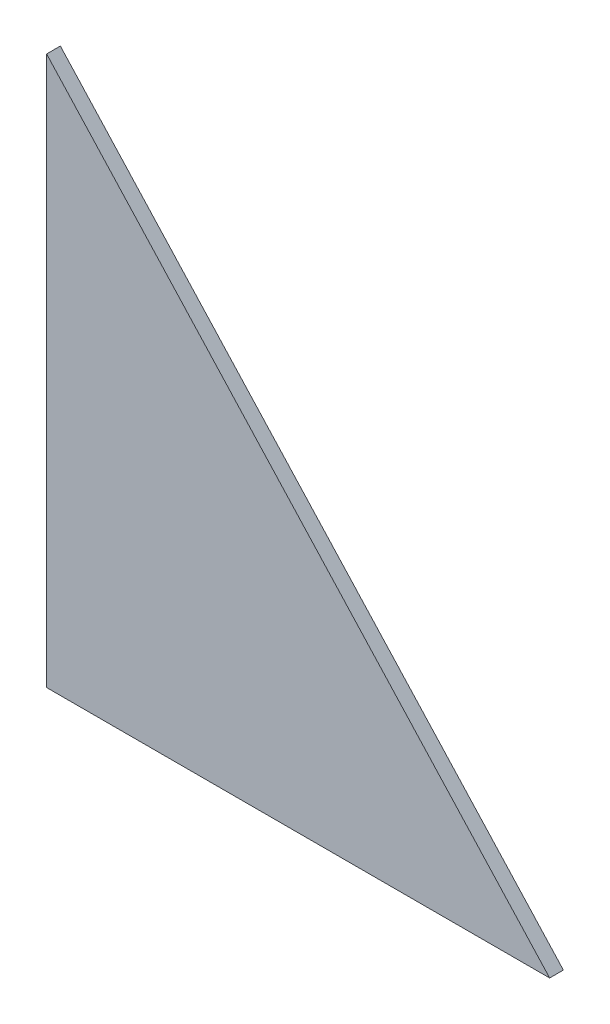
ISO-10303-21;
HEADER;
FILE_DESCRIPTION(('STEP AP214'),'2;1');
FILE_NAME('part.step','',(''),(''),'','','');
FILE_SCHEMA(('AUTOMOTIVE_DESIGN { 1 0 10303 214 1 1 1 1 }'));
ENDSEC;
DATA;
#1=APPLICATION_CONTEXT('core data for automotive mechanical design processes');
#2=APPLICATION_PROTOCOL_DEFINITION('international standard','automotive_design',2000,#1);
#3=PRODUCT_CONTEXT('',#1,'mechanical');
#4=PRODUCT('Part','Part','',(#3));
#5=PRODUCT_RELATED_PRODUCT_CATEGORY('part','',(#4));
#6=PRODUCT_DEFINITION_FORMATION('','',#4);
#7=PRODUCT_DEFINITION_CONTEXT('part definition',#1,'design');
#8=PRODUCT_DEFINITION('design','',#6,#7);
#9=PRODUCT_DEFINITION_SHAPE('','',#8);
#10=(LENGTH_UNIT() NAMED_UNIT(*) SI_UNIT(.MILLI.,.METRE.));
#11=(NAMED_UNIT(*) PLANE_ANGLE_UNIT() SI_UNIT($,.RADIAN.));
#12=(NAMED_UNIT(*) SI_UNIT($,.STERADIAN.) SOLID_ANGLE_UNIT());
#13=UNCERTAINTY_MEASURE_WITH_UNIT(LENGTH_MEASURE(1.E-05),#10,'distance_accuracy_value','');
#14=(GEOMETRIC_REPRESENTATION_CONTEXT(3) GLOBAL_UNCERTAINTY_ASSIGNED_CONTEXT((#13)) GLOBAL_UNIT_ASSIGNED_CONTEXT((#10,
#11,#12)) REPRESENTATION_CONTEXT('',''));
#15=CARTESIAN_POINT('',(0.,0.,0.));
#16=DIRECTION('',(0.,0.,1.));
#17=DIRECTION('',(1.,0.,0.));
#18=AXIS2_PLACEMENT_3D('',#15,#16,#17);
#19=CARTESIAN_POINT('',(0.,60.,1.5));
#20=DIRECTION('',(-0.737154140200741,-0.675724628517346,0.));
#21=DIRECTION('',(0.675724628517346,-0.737154140200741,0.));
#22=AXIS2_PLACEMENT_3D('',#19,#20,#21);
#23=PLANE('',#22);
#24=DIRECTION('',(-0.675724628517346,0.737154140200741,0.));
#25=VECTOR('',#24,1.);
#26=CARTESIAN_POINT('',(0.,60.,0.));
#27=LINE('',#26,#25);
#28=CARTESIAN_POINT('',(55.,0.,0.));
#29=VERTEX_POINT('',#28);
#30=CARTESIAN_POINT('',(0.,60.,0.));
#31=VERTEX_POINT('',#30);
#32=EDGE_CURVE('E82',#29,#31,#27,.T.);
#33=ORIENTED_EDGE('',*,*,#32,.T.);
#34=DIRECTION('',(0.,0.,-1.));
#35=VECTOR('',#34,1.);
#36=CARTESIAN_POINT('',(0.,60.,1.5));
#37=LINE('',#36,#35);
#38=CARTESIAN_POINT('',(0.,60.,1.5));
#39=VERTEX_POINT('',#38);
#40=EDGE_CURVE('E11',#39,#31,#37,.T.);
#41=ORIENTED_EDGE('',*,*,#40,.F.);
#42=DIRECTION('',(-0.675724628517346,0.737154140200741,0.));
#43=VECTOR('',#42,1.);
#44=CARTESIAN_POINT('',(0.,60.,1.5));
#45=LINE('',#44,#43);
#46=CARTESIAN_POINT('',(55.,0.,1.5));
#47=VERTEX_POINT('',#46);
#48=EDGE_CURVE('E75',#47,#39,#45,.T.);
#49=ORIENTED_EDGE('',*,*,#48,.F.);
#50=DIRECTION('',(0.,0.,-1.));
#51=VECTOR('',#50,1.);
#52=CARTESIAN_POINT('',(55.,0.,1.5));
#53=LINE('',#52,#51);
#54=EDGE_CURVE('E83',#47,#29,#53,.T.);
#55=ORIENTED_EDGE('',*,*,#54,.T.);
#56=EDGE_LOOP('',(#33,#41,#49,#55));
#57=FACE_BOUND('',#56,.T.);
#58=ADVANCED_FACE('F35',(#57),#23,.F.);
#59=CARTESIAN_POINT('',(0.,0.,1.5));
#60=DIRECTION('',(1.,0.,0.));
#61=DIRECTION('',(0.,1.,0.));
#62=AXIS2_PLACEMENT_3D('',#59,#60,#61);
#63=PLANE('',#62);
#64=DIRECTION('',(0.,-1.,0.));
#65=VECTOR('',#64,1.);
#66=CARTESIAN_POINT('',(0.,0.,0.));
#67=LINE('',#66,#65);
#68=CARTESIAN_POINT('',(0.,0.,0.));
#69=VERTEX_POINT('',#68);
#70=EDGE_CURVE('E63',#31,#69,#67,.T.);
#71=ORIENTED_EDGE('',*,*,#70,.T.);
#72=DIRECTION('',(0.,0.,-1.));
#73=VECTOR('',#72,1.);
#74=CARTESIAN_POINT('',(0.,0.,1.5));
#75=LINE('',#74,#73);
#76=CARTESIAN_POINT('',(0.,0.,1.5));
#77=VERTEX_POINT('',#76);
#78=EDGE_CURVE('E43',#77,#69,#75,.T.);
#79=ORIENTED_EDGE('',*,*,#78,.F.);
#80=DIRECTION('',(0.,-1.,0.));
#81=VECTOR('',#80,1.);
#82=CARTESIAN_POINT('',(0.,0.,1.5));
#83=LINE('',#82,#81);
#84=EDGE_CURVE('E71',#39,#77,#83,.T.);
#85=ORIENTED_EDGE('',*,*,#84,.F.);
#86=ORIENTED_EDGE('',*,*,#40,.T.);
#87=EDGE_LOOP('',(#71,#79,#85,#86));
#88=FACE_BOUND('',#87,.T.);
#89=ADVANCED_FACE('F72',(#88),#63,.F.);
#90=CARTESIAN_POINT('',(55.,0.,1.5));
#91=DIRECTION('',(0.,1.,0.));
#92=DIRECTION('',(0.,0.,1.));
#93=AXIS2_PLACEMENT_3D('',#90,#91,#92);
#94=PLANE('',#93);
#95=DIRECTION('',(1.,0.,0.));
#96=VECTOR('',#95,1.);
#97=CARTESIAN_POINT('',(55.,0.,0.));
#98=LINE('',#97,#96);
#99=EDGE_CURVE('E68',#69,#29,#98,.T.);
#100=ORIENTED_EDGE('',*,*,#99,.T.);
#101=ORIENTED_EDGE('',*,*,#54,.F.);
#102=DIRECTION('',(1.,0.,0.));
#103=VECTOR('',#102,1.);
#104=CARTESIAN_POINT('',(55.,0.,1.5));
#105=LINE('',#104,#103);
#106=EDGE_CURVE('E51',#77,#47,#105,.T.);
#107=ORIENTED_EDGE('',*,*,#106,.F.);
#108=ORIENTED_EDGE('',*,*,#78,.T.);
#109=EDGE_LOOP('',(#100,#101,#107,#108));
#110=FACE_BOUND('',#109,.T.);
#111=ADVANCED_FACE('F90',(#110),#94,.F.);
#112=CARTESIAN_POINT('',(0.,0.,1.5));
#113=DIRECTION('',(0.,0.,-1.));
#114=DIRECTION('',(-1.,0.,0.));
#115=AXIS2_PLACEMENT_3D('',#112,#113,#114);
#116=PLANE('',#115);
#117=ORIENTED_EDGE('',*,*,#48,.T.);
#118=ORIENTED_EDGE('',*,*,#84,.T.);
#119=ORIENTED_EDGE('',*,*,#106,.T.);
#120=EDGE_LOOP('',(#117,#118,#119));
#121=FACE_BOUND('',#120,.T.);
#122=ADVANCED_FACE('F78',(#121),#116,.F.);
#123=CARTESIAN_POINT('',(0.,0.,0.));
#124=DIRECTION('',(0.,0.,-1.));
#125=DIRECTION('',(-1.,0.,0.));
#126=AXIS2_PLACEMENT_3D('',#123,#124,#125);
#127=PLANE('',#126);
#128=ORIENTED_EDGE('',*,*,#32,.F.);
#129=ORIENTED_EDGE('',*,*,#99,.F.);
#130=ORIENTED_EDGE('',*,*,#70,.F.);
#131=EDGE_LOOP('',(#128,#129,#130));
#132=FACE_BOUND('',#131,.T.);
#133=ADVANCED_FACE('F91',(#132),#127,.T.);
#134=CLOSED_SHELL('',(#58,#89,#111,#122,#133));
#135=MANIFOLD_SOLID_BREP('B2',#134);
#136=ADVANCED_BREP_SHAPE_REPRESENTATION('',(#18,#135),#14);
#137=SHAPE_DEFINITION_REPRESENTATION(#9,#136);
ENDSEC;
END-ISO-10303-21;
